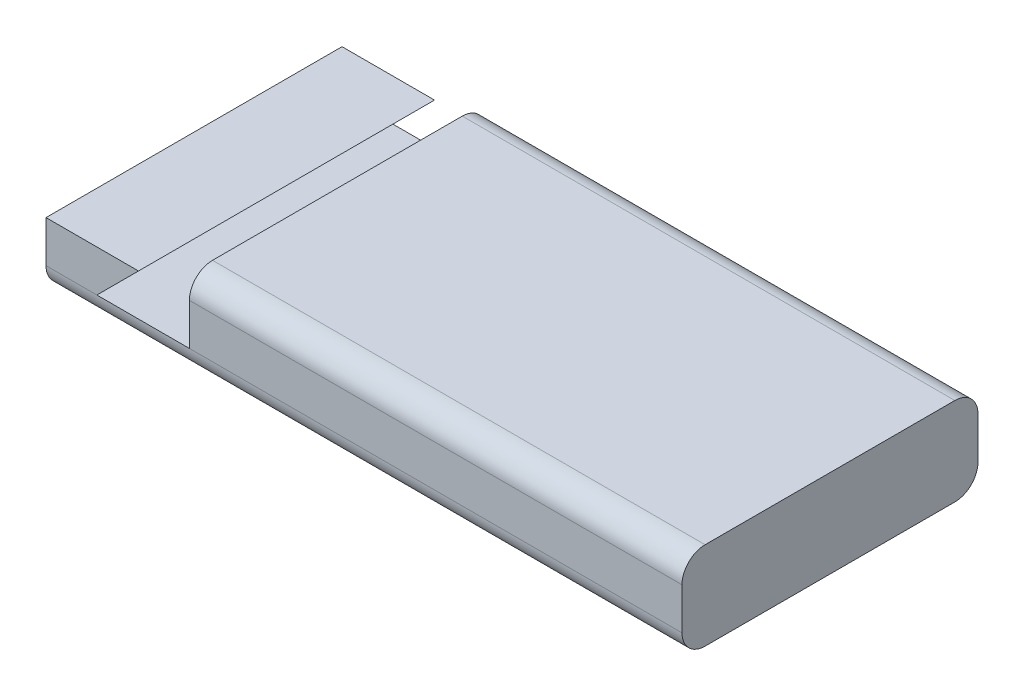
ISO-10303-21;
HEADER;
FILE_DESCRIPTION(('STEP AP214'),'2;1');
FILE_NAME('part.step','',(''),(''),'','','');
FILE_SCHEMA(('AUTOMOTIVE_DESIGN { 1 0 10303 214 1 1 1 1 }'));
ENDSEC;
DATA;
#1=APPLICATION_CONTEXT('core data for automotive mechanical design processes');
#2=APPLICATION_PROTOCOL_DEFINITION('international standard','automotive_design',2000,#1);
#3=PRODUCT_CONTEXT('',#1,'mechanical');
#4=PRODUCT('Part','Part','',(#3));
#5=PRODUCT_RELATED_PRODUCT_CATEGORY('part','',(#4));
#6=PRODUCT_DEFINITION_FORMATION('','',#4);
#7=PRODUCT_DEFINITION_CONTEXT('part definition',#1,'design');
#8=PRODUCT_DEFINITION('design','',#6,#7);
#9=PRODUCT_DEFINITION_SHAPE('','',#8);
#10=(LENGTH_UNIT() NAMED_UNIT(*) SI_UNIT(.MILLI.,.METRE.));
#11=(NAMED_UNIT(*) PLANE_ANGLE_UNIT() SI_UNIT($,.RADIAN.));
#12=(NAMED_UNIT(*) SI_UNIT($,.STERADIAN.) SOLID_ANGLE_UNIT());
#13=UNCERTAINTY_MEASURE_WITH_UNIT(LENGTH_MEASURE(1.E-05),#10,'distance_accuracy_value','');
#14=(GEOMETRIC_REPRESENTATION_CONTEXT(3) GLOBAL_UNCERTAINTY_ASSIGNED_CONTEXT((#13)) GLOBAL_UNIT_ASSIGNED_CONTEXT((#10,
#11,#12)) REPRESENTATION_CONTEXT('',''));
#15=CARTESIAN_POINT('',(0.,0.,0.));
#16=DIRECTION('',(0.,0.,1.));
#17=DIRECTION('',(1.,0.,0.));
#18=AXIS2_PLACEMENT_3D('',#15,#16,#17);
#19=CARTESIAN_POINT('',(0.,7.6,0.));
#20=DIRECTION('',(0.,0.,-1.));
#21=DIRECTION('',(-1.,0.,0.));
#22=AXIS2_PLACEMENT_3D('',#19,#20,#21);
#23=PLANE('',#22);
#24=DIRECTION('',(0.,-1.,0.));
#25=VECTOR('',#24,1.);
#26=CARTESIAN_POINT('',(0.,7.6,0.));
#27=LINE('',#26,#25);
#28=CARTESIAN_POINT('',(0.,5.6,0.));
#29=VERTEX_POINT('',#28);
#30=CARTESIAN_POINT('',(0.,2.,0.));
#31=VERTEX_POINT('',#30);
#32=EDGE_CURVE('E195',#29,#31,#27,.T.);
#33=ORIENTED_EDGE('',*,*,#32,.T.);
#34=DIRECTION('',(1.,0.,0.));
#35=VECTOR('',#34,1.);
#36=CARTESIAN_POINT('',(55.,2.,0.));
#37=LINE('',#36,#35);
#38=CARTESIAN_POINT('',(4.39999999999992,2.,0.));
#39=VERTEX_POINT('',#38);
#40=EDGE_CURVE('E156',#31,#39,#37,.T.);
#41=ORIENTED_EDGE('',*,*,#40,.T.);
#42=DIRECTION('',(-0.707106781186556,-0.707106781186539,0.));
#43=VECTOR('',#42,1.);
#44=CARTESIAN_POINT('',(1.1999999999999,-1.19999999999993,0.));
#45=LINE('',#44,#43);
#46=CARTESIAN_POINT('',(8.,5.6,0.));
#47=VERTEX_POINT('',#46);
#48=EDGE_CURVE('E149',#47,#39,#45,.T.);
#49=ORIENTED_EDGE('',*,*,#48,.F.);
#50=DIRECTION('',(1.,0.,0.));
#51=VECTOR('',#50,1.);
#52=CARTESIAN_POINT('',(0.,5.6,0.));
#53=LINE('',#52,#51);
#54=EDGE_CURVE('E174',#29,#47,#53,.T.);
#55=ORIENTED_EDGE('',*,*,#54,.F.);
#56=EDGE_LOOP('',(#33,#41,#49,#55));
#57=FACE_BOUND('',#56,.T.);
#58=ADVANCED_FACE('F33',(#57),#23,.F.);
#59=CARTESIAN_POINT('',(0.,7.6,-25.6));
#60=DIRECTION('',(0.,0.,1.));
#61=DIRECTION('',(1.,0.,0.));
#62=AXIS2_PLACEMENT_3D('',#59,#60,#61);
#63=PLANE('',#62);
#64=DIRECTION('',(0.,-1.,0.));
#65=VECTOR('',#64,1.);
#66=CARTESIAN_POINT('',(55.,7.6,-25.6));
#67=LINE('',#66,#65);
#68=CARTESIAN_POINT('',(55.,5.6,-25.6));
#69=VERTEX_POINT('',#68);
#70=CARTESIAN_POINT('',(55.,2.,-25.6));
#71=VERTEX_POINT('',#70);
#72=EDGE_CURVE('E190',#69,#71,#67,.T.);
#73=ORIENTED_EDGE('',*,*,#72,.T.);
#74=DIRECTION('',(-1.,0.,0.));
#75=VECTOR('',#74,1.);
#76=CARTESIAN_POINT('',(0.,2.,-25.6));
#77=LINE('',#76,#75);
#78=CARTESIAN_POINT('',(12.4,2.,-25.6));
#79=VERTEX_POINT('',#78);
#80=EDGE_CURVE('E202',#71,#79,#77,.T.);
#81=ORIENTED_EDGE('',*,*,#80,.T.);
#82=DIRECTION('',(0.,-1.,0.));
#83=VECTOR('',#82,1.);
#84=CARTESIAN_POINT('',(12.4,0.,-25.6));
#85=LINE('',#84,#83);
#86=CARTESIAN_POINT('',(12.4,5.6,-25.6));
#87=VERTEX_POINT('',#86);
#88=EDGE_CURVE('E138',#87,#79,#85,.T.);
#89=ORIENTED_EDGE('',*,*,#88,.F.);
#90=DIRECTION('',(-1.,0.,0.));
#91=VECTOR('',#90,1.);
#92=CARTESIAN_POINT('',(0.,5.6,-25.6));
#93=LINE('',#92,#91);
#94=EDGE_CURVE('E198',#87,#69,#93,.F.);
#95=ORIENTED_EDGE('',*,*,#94,.T.);
#96=EDGE_LOOP('',(#73,#81,#89,#95));
#97=FACE_BOUND('',#96,.T.);
#98=ADVANCED_FACE('F226',(#97),#63,.F.);
#99=CARTESIAN_POINT('',(0.,7.6,0.));
#100=DIRECTION('',(1.,0.,0.));
#101=DIRECTION('',(0.,0.,-1.));
#102=AXIS2_PLACEMENT_3D('',#99,#100,#101);
#103=PLANE('',#102);
#104=DIRECTION('',(0.,-1.,0.));
#105=VECTOR('',#104,1.);
#106=CARTESIAN_POINT('',(0.,7.6,-25.6));
#107=LINE('',#106,#105);
#108=CARTESIAN_POINT('',(0.,5.6,-25.6));
#109=VERTEX_POINT('',#108);
#110=CARTESIAN_POINT('',(0.,2.,-25.6));
#111=VERTEX_POINT('',#110);
#112=EDGE_CURVE('E180',#109,#111,#107,.T.);
#113=ORIENTED_EDGE('',*,*,#112,.T.);
#114=CARTESIAN_POINT('',(0.,2.,-23.6));
#115=DIRECTION('',(1.,0.,0.));
#116=DIRECTION('',(0.,0.,-1.));
#117=AXIS2_PLACEMENT_3D('',#114,#115,#116);
#118=CIRCLE('',#117,2.);
#119=CARTESIAN_POINT('',(0.,0.,-23.6));
#120=VERTEX_POINT('',#119);
#121=EDGE_CURVE('E207',#111,#120,#118,.F.);
#122=ORIENTED_EDGE('',*,*,#121,.T.);
#123=DIRECTION('',(0.,0.,1.));
#124=VECTOR('',#123,1.);
#125=CARTESIAN_POINT('',(0.,0.,0.));
#126=LINE('',#125,#124);
#127=CARTESIAN_POINT('',(0.,0.,-2.));
#128=VERTEX_POINT('',#127);
#129=EDGE_CURVE('E182',#120,#128,#126,.T.);
#130=ORIENTED_EDGE('',*,*,#129,.T.);
#131=CARTESIAN_POINT('',(0.,2.,-2.));
#132=DIRECTION('',(1.,0.,0.));
#133=DIRECTION('',(0.,0.,-1.));
#134=AXIS2_PLACEMENT_3D('',#131,#132,#133);
#135=CIRCLE('',#134,2.);
#136=EDGE_CURVE('E205',#128,#31,#135,.F.);
#137=ORIENTED_EDGE('',*,*,#136,.T.);
#138=ORIENTED_EDGE('',*,*,#32,.F.);
#139=DIRECTION('',(0.,0.,-1.));
#140=VECTOR('',#139,1.);
#141=CARTESIAN_POINT('',(0.,5.6,0.));
#142=LINE('',#141,#140);
#143=EDGE_CURVE('E185',#29,#109,#142,.T.);
#144=ORIENTED_EDGE('',*,*,#143,.T.);
#145=EDGE_LOOP('',(#113,#122,#130,#137,#138,#144));
#146=FACE_BOUND('',#145,.T.);
#147=ADVANCED_FACE('F253',(#146),#103,.F.);
#148=DIRECTION('',(0.,-1.,0.));
#149=VECTOR('',#148,1.);
#150=CARTESIAN_POINT('',(12.4,0.,0.));
#151=LINE('',#150,#149);
#152=CARTESIAN_POINT('',(12.4,5.6,0.));
#153=VERTEX_POINT('',#152);
#154=CARTESIAN_POINT('',(12.4,2.,0.));
#155=VERTEX_POINT('',#154);
#156=EDGE_CURVE('E120',#153,#155,#151,.T.);
#157=ORIENTED_EDGE('',*,*,#156,.T.);
#158=DIRECTION('',(1.,0.,0.));
#159=VECTOR('',#158,1.);
#160=CARTESIAN_POINT('',(55.,2.,0.));
#161=LINE('',#160,#159);
#162=CARTESIAN_POINT('',(55.,2.,0.));
#163=VERTEX_POINT('',#162);
#164=EDGE_CURVE('E125',#155,#163,#161,.T.);
#165=ORIENTED_EDGE('',*,*,#164,.T.);
#166=DIRECTION('',(0.,-1.,0.));
#167=VECTOR('',#166,1.);
#168=CARTESIAN_POINT('',(55.,7.6,0.));
#169=LINE('',#168,#167);
#170=CARTESIAN_POINT('',(55.,5.6,0.));
#171=VERTEX_POINT('',#170);
#172=EDGE_CURVE('E193',#171,#163,#169,.T.);
#173=ORIENTED_EDGE('',*,*,#172,.F.);
#174=DIRECTION('',(1.,0.,0.));
#175=VECTOR('',#174,1.);
#176=CARTESIAN_POINT('',(0.,5.6,0.));
#177=LINE('',#176,#175);
#178=EDGE_CURVE('E128',#171,#153,#177,.F.);
#179=ORIENTED_EDGE('',*,*,#178,.T.);
#180=EDGE_LOOP('',(#157,#165,#173,#179));
#181=FACE_BOUND('',#180,.T.);
#182=ADVANCED_FACE('F122',(#181),#23,.F.);
#183=DIRECTION('',(-0.707106781186556,-0.707106781186539,0.));
#184=VECTOR('',#183,1.);
#185=CARTESIAN_POINT('',(1.1999999999999,-1.19999999999993,-25.6));
#186=LINE('',#185,#184);
#187=CARTESIAN_POINT('',(8.,5.6,-25.6));
#188=VERTEX_POINT('',#187);
#189=CARTESIAN_POINT('',(4.39999999999992,2.,-25.6));
#190=VERTEX_POINT('',#189);
#191=EDGE_CURVE('E232',#188,#190,#186,.T.);
#192=ORIENTED_EDGE('',*,*,#191,.T.);
#193=DIRECTION('',(-1.,0.,0.));
#194=VECTOR('',#193,1.);
#195=CARTESIAN_POINT('',(0.,2.,-25.6));
#196=LINE('',#195,#194);
#197=EDGE_CURVE('E200',#190,#111,#196,.T.);
#198=ORIENTED_EDGE('',*,*,#197,.T.);
#199=ORIENTED_EDGE('',*,*,#112,.F.);
#200=DIRECTION('',(1.,0.,0.));
#201=VECTOR('',#200,1.);
#202=CARTESIAN_POINT('',(0.,5.6,-25.6));
#203=LINE('',#202,#201);
#204=EDGE_CURVE('E130',#109,#188,#203,.T.);
#205=ORIENTED_EDGE('',*,*,#204,.T.);
#206=EDGE_LOOP('',(#192,#198,#199,#205));
#207=FACE_BOUND('',#206,.T.);
#208=ADVANCED_FACE('F273',(#207),#63,.F.);
#209=CARTESIAN_POINT('',(55.,7.6,0.));
#210=DIRECTION('',(-1.,0.,0.));
#211=DIRECTION('',(0.,0.,1.));
#212=AXIS2_PLACEMENT_3D('',#209,#210,#211);
#213=PLANE('',#212);
#214=DIRECTION('',(0.,0.,-1.));
#215=VECTOR('',#214,1.);
#216=CARTESIAN_POINT('',(55.,0.,0.));
#217=LINE('',#216,#215);
#218=CARTESIAN_POINT('',(55.,0.,-2.));
#219=VERTEX_POINT('',#218);
#220=CARTESIAN_POINT('',(55.,0.,-23.6));
#221=VERTEX_POINT('',#220);
#222=EDGE_CURVE('E181',#219,#221,#217,.T.);
#223=ORIENTED_EDGE('',*,*,#222,.T.);
#224=CARTESIAN_POINT('',(55.,2.,-23.6));
#225=DIRECTION('',(-1.,0.,0.));
#226=DIRECTION('',(0.,0.,1.));
#227=AXIS2_PLACEMENT_3D('',#224,#225,#226);
#228=CIRCLE('',#227,2.);
#229=EDGE_CURVE('E160',#221,#71,#228,.F.);
#230=ORIENTED_EDGE('',*,*,#229,.T.);
#231=ORIENTED_EDGE('',*,*,#72,.F.);
#232=CARTESIAN_POINT('',(55.,5.6,-23.6));
#233=DIRECTION('',(-1.,0.,0.));
#234=DIRECTION('',(0.,0.,1.));
#235=AXIS2_PLACEMENT_3D('',#232,#233,#234);
#236=CIRCLE('',#235,2.);
#237=CARTESIAN_POINT('',(55.,7.6,-23.6));
#238=VERTEX_POINT('',#237);
#239=EDGE_CURVE('E215',#69,#238,#236,.F.);
#240=ORIENTED_EDGE('',*,*,#239,.T.);
#241=DIRECTION('',(0.,0.,-1.));
#242=VECTOR('',#241,1.);
#243=CARTESIAN_POINT('',(55.,7.6,0.));
#244=LINE('',#243,#242);
#245=CARTESIAN_POINT('',(55.,7.6,-2.));
#246=VERTEX_POINT('',#245);
#247=EDGE_CURVE('E172',#246,#238,#244,.T.);
#248=ORIENTED_EDGE('',*,*,#247,.F.);
#249=CARTESIAN_POINT('',(55.,5.6,-2.));
#250=DIRECTION('',(-1.,0.,0.));
#251=DIRECTION('',(0.,0.,1.));
#252=AXIS2_PLACEMENT_3D('',#249,#250,#251);
#253=CIRCLE('',#252,2.);
#254=EDGE_CURVE('E213',#246,#171,#253,.F.);
#255=ORIENTED_EDGE('',*,*,#254,.T.);
#256=ORIENTED_EDGE('',*,*,#172,.T.);
#257=CARTESIAN_POINT('',(55.,2.,-2.));
#258=DIRECTION('',(-1.,0.,0.));
#259=DIRECTION('',(0.,0.,1.));
#260=AXIS2_PLACEMENT_3D('',#257,#258,#259);
#261=CIRCLE('',#260,2.);
#262=EDGE_CURVE('E155',#163,#219,#261,.F.);
#263=ORIENTED_EDGE('',*,*,#262,.T.);
#264=EDGE_LOOP('',(#223,#230,#231,#240,#248,#255,#256,#263));
#265=FACE_BOUND('',#264,.T.);
#266=ADVANCED_FACE('F220',(#265),#213,.F.);
#267=CARTESIAN_POINT('',(0.,7.6,0.));
#268=DIRECTION('',(0.,-1.,0.));
#269=DIRECTION('',(0.,0.,-1.));
#270=AXIS2_PLACEMENT_3D('',#267,#268,#269);
#271=PLANE('',#270);
#272=ORIENTED_EDGE('',*,*,#247,.T.);
#273=DIRECTION('',(-1.,0.,0.));
#274=VECTOR('',#273,1.);
#275=CARTESIAN_POINT('',(0.,7.6,-23.6));
#276=LINE('',#275,#274);
#277=CARTESIAN_POINT('',(12.4,7.6,-23.6));
#278=VERTEX_POINT('',#277);
#279=EDGE_CURVE('E166',#238,#278,#276,.T.);
#280=ORIENTED_EDGE('',*,*,#279,.T.);
#281=DIRECTION('',(0.,0.,-1.));
#282=VECTOR('',#281,1.);
#283=CARTESIAN_POINT('',(12.4,7.6,0.));
#284=LINE('',#283,#282);
#285=CARTESIAN_POINT('',(12.4,7.6,-2.));
#286=VERTEX_POINT('',#285);
#287=EDGE_CURVE('E142',#286,#278,#284,.T.);
#288=ORIENTED_EDGE('',*,*,#287,.F.);
#289=DIRECTION('',(1.,0.,0.));
#290=VECTOR('',#289,1.);
#291=CARTESIAN_POINT('',(0.,7.6,-2.));
#292=LINE('',#291,#290);
#293=EDGE_CURVE('E158',#286,#246,#292,.T.);
#294=ORIENTED_EDGE('',*,*,#293,.T.);
#295=EDGE_LOOP('',(#272,#280,#288,#294));
#296=FACE_BOUND('',#295,.T.);
#297=ADVANCED_FACE('F169',(#296),#271,.F.);
#298=CARTESIAN_POINT('',(0.,0.,0.));
#299=DIRECTION('',(0.,-1.,0.));
#300=DIRECTION('',(0.,0.,-1.));
#301=AXIS2_PLACEMENT_3D('',#298,#299,#300);
#302=PLANE('',#301);
#303=ORIENTED_EDGE('',*,*,#129,.F.);
#304=DIRECTION('',(-1.,0.,0.));
#305=VECTOR('',#304,1.);
#306=CARTESIAN_POINT('',(55.,0.,-23.6));
#307=LINE('',#306,#305);
#308=EDGE_CURVE('E211',#120,#221,#307,.F.);
#309=ORIENTED_EDGE('',*,*,#308,.T.);
#310=ORIENTED_EDGE('',*,*,#222,.F.);
#311=DIRECTION('',(1.,0.,0.));
#312=VECTOR('',#311,1.);
#313=CARTESIAN_POINT('',(0.,0.,-2.));
#314=LINE('',#313,#312);
#315=EDGE_CURVE('E209',#219,#128,#314,.F.);
#316=ORIENTED_EDGE('',*,*,#315,.T.);
#317=EDGE_LOOP('',(#303,#309,#310,#316));
#318=FACE_BOUND('',#317,.T.);
#319=ADVANCED_FACE('F256',(#318),#302,.T.);
#320=CARTESIAN_POINT('',(0.,5.6,0.));
#321=DIRECTION('',(0.,1.,0.));
#322=DIRECTION('',(-1.,0.,0.));
#323=AXIS2_PLACEMENT_3D('',#320,#321,#322);
#324=PLANE('',#323);
#325=ORIENTED_EDGE('',*,*,#204,.F.);
#326=ORIENTED_EDGE('',*,*,#143,.F.);
#327=ORIENTED_EDGE('',*,*,#54,.T.);
#328=DIRECTION('',(0.,0.,-1.));
#329=VECTOR('',#328,1.);
#330=CARTESIAN_POINT('',(8.,5.6,0.));
#331=LINE('',#330,#329);
#332=EDGE_CURVE('E241',#47,#188,#331,.T.);
#333=ORIENTED_EDGE('',*,*,#332,.T.);
#334=EDGE_LOOP('',(#325,#326,#327,#333));
#335=FACE_BOUND('',#334,.T.);
#336=ADVANCED_FACE('F258',(#335),#324,.T.);
#337=CARTESIAN_POINT('',(1.1999999999999,-1.19999999999993,0.));
#338=DIRECTION('',(0.707106781186539,-0.707106781186556,0.));
#339=DIRECTION('',(0.707106781186556,0.707106781186539,0.));
#340=AXIS2_PLACEMENT_3D('',#337,#338,#339);
#341=PLANE('',#340);
#342=ORIENTED_EDGE('',*,*,#191,.F.);
#343=ORIENTED_EDGE('',*,*,#332,.F.);
#344=ORIENTED_EDGE('',*,*,#48,.T.);
#345=DIRECTION('',(0.,0.,-1.));
#346=VECTOR('',#345,1.);
#347=CARTESIAN_POINT('',(4.39999999999992,2.,0.));
#348=LINE('',#347,#346);
#349=EDGE_CURVE('E141',#39,#190,#348,.T.);
#350=ORIENTED_EDGE('',*,*,#349,.T.);
#351=EDGE_LOOP('',(#342,#343,#344,#350));
#352=FACE_BOUND('',#351,.T.);
#353=ADVANCED_FACE('F245',(#352),#341,.T.);
#354=CARTESIAN_POINT('',(0.,2.,0.));
#355=DIRECTION('',(0.,-1.,0.));
#356=DIRECTION('',(0.,0.,-1.));
#357=AXIS2_PLACEMENT_3D('',#354,#355,#356);
#358=PLANE('',#357);
#359=DIRECTION('',(-1.,0.,0.));
#360=VECTOR('',#359,1.);
#361=CARTESIAN_POINT('',(0.,2.,-25.6));
#362=LINE('',#361,#360);
#363=EDGE_CURVE('E229',#79,#190,#362,.T.);
#364=ORIENTED_EDGE('',*,*,#363,.T.);
#365=ORIENTED_EDGE('',*,*,#349,.F.);
#366=DIRECTION('',(-1.,0.,0.));
#367=VECTOR('',#366,1.);
#368=CARTESIAN_POINT('',(0.,2.,0.));
#369=LINE('',#368,#367);
#370=EDGE_CURVE('E129',#155,#39,#369,.T.);
#371=ORIENTED_EDGE('',*,*,#370,.F.);
#372=DIRECTION('',(0.,0.,-1.));
#373=VECTOR('',#372,1.);
#374=CARTESIAN_POINT('',(12.4,2.,0.));
#375=LINE('',#374,#373);
#376=EDGE_CURVE('E134',#155,#79,#375,.T.);
#377=ORIENTED_EDGE('',*,*,#376,.T.);
#378=EDGE_LOOP('',(#364,#365,#371,#377));
#379=FACE_BOUND('',#378,.T.);
#380=ADVANCED_FACE('F145',(#379),#358,.F.);
#381=CARTESIAN_POINT('',(12.4,0.,0.));
#382=DIRECTION('',(1.,0.,0.));
#383=DIRECTION('',(0.,1.,0.));
#384=AXIS2_PLACEMENT_3D('',#381,#382,#383);
#385=PLANE('',#384);
#386=ORIENTED_EDGE('',*,*,#287,.T.);
#387=CARTESIAN_POINT('',(12.4,5.6,-23.6));
#388=DIRECTION('',(1.,0.,0.));
#389=DIRECTION('',(0.,1.,0.));
#390=AXIS2_PLACEMENT_3D('',#387,#388,#389);
#391=CIRCLE('',#390,2.);
#392=EDGE_CURVE('E11',#278,#87,#391,.F.);
#393=ORIENTED_EDGE('',*,*,#392,.T.);
#394=ORIENTED_EDGE('',*,*,#88,.T.);
#395=ORIENTED_EDGE('',*,*,#376,.F.);
#396=ORIENTED_EDGE('',*,*,#156,.F.);
#397=CARTESIAN_POINT('',(12.4,5.6,-2.));
#398=DIRECTION('',(1.,0.,0.));
#399=DIRECTION('',(0.,1.,0.));
#400=AXIS2_PLACEMENT_3D('',#397,#398,#399);
#401=CIRCLE('',#400,2.);
#402=EDGE_CURVE('E41',#153,#286,#401,.F.);
#403=ORIENTED_EDGE('',*,*,#402,.T.);
#404=EDGE_LOOP('',(#386,#393,#394,#395,#396,#403));
#405=FACE_BOUND('',#404,.T.);
#406=ADVANCED_FACE('F136',(#405),#385,.F.);
#407=CARTESIAN_POINT('',(0.,2.,-23.6));
#408=DIRECTION('',(1.,0.,0.));
#409=DIRECTION('',(0.,0.,-1.));
#410=AXIS2_PLACEMENT_3D('',#407,#408,#409);
#411=CYLINDRICAL_SURFACE('',#410,2.);
#412=ORIENTED_EDGE('',*,*,#229,.F.);
#413=ORIENTED_EDGE('',*,*,#308,.F.);
#414=ORIENTED_EDGE('',*,*,#121,.F.);
#415=ORIENTED_EDGE('',*,*,#197,.F.);
#416=ORIENTED_EDGE('',*,*,#363,.F.);
#417=ORIENTED_EDGE('',*,*,#80,.F.);
#418=EDGE_LOOP('',(#412,#413,#414,#415,#416,#417));
#419=FACE_BOUND('',#418,.T.);
#420=ADVANCED_FACE('F227',(#419),#411,.T.);
#421=CARTESIAN_POINT('',(0.,2.,-2.));
#422=DIRECTION('',(-1.,0.,0.));
#423=DIRECTION('',(0.,0.,1.));
#424=AXIS2_PLACEMENT_3D('',#421,#422,#423);
#425=CYLINDRICAL_SURFACE('',#424,2.);
#426=ORIENTED_EDGE('',*,*,#136,.F.);
#427=ORIENTED_EDGE('',*,*,#315,.F.);
#428=ORIENTED_EDGE('',*,*,#262,.F.);
#429=ORIENTED_EDGE('',*,*,#164,.F.);
#430=ORIENTED_EDGE('',*,*,#370,.T.);
#431=ORIENTED_EDGE('',*,*,#40,.F.);
#432=EDGE_LOOP('',(#426,#427,#428,#429,#430,#431));
#433=FACE_BOUND('',#432,.T.);
#434=ADVANCED_FACE('F153',(#433),#425,.T.);
#435=CARTESIAN_POINT('',(0.,5.6,-23.6));
#436=DIRECTION('',(-1.,0.,0.));
#437=DIRECTION('',(0.,0.,1.));
#438=AXIS2_PLACEMENT_3D('',#435,#436,#437);
#439=CYLINDRICAL_SURFACE('',#438,2.);
#440=ORIENTED_EDGE('',*,*,#239,.F.);
#441=ORIENTED_EDGE('',*,*,#94,.F.);
#442=ORIENTED_EDGE('',*,*,#392,.F.);
#443=ORIENTED_EDGE('',*,*,#279,.F.);
#444=EDGE_LOOP('',(#440,#441,#442,#443));
#445=FACE_BOUND('',#444,.T.);
#446=ADVANCED_FACE('F288',(#445),#439,.T.);
#447=CARTESIAN_POINT('',(0.,5.6,-2.));
#448=DIRECTION('',(1.,0.,0.));
#449=DIRECTION('',(0.,0.,-1.));
#450=AXIS2_PLACEMENT_3D('',#447,#448,#449);
#451=CYLINDRICAL_SURFACE('',#450,2.);
#452=ORIENTED_EDGE('',*,*,#402,.F.);
#453=ORIENTED_EDGE('',*,*,#178,.F.);
#454=ORIENTED_EDGE('',*,*,#254,.F.);
#455=ORIENTED_EDGE('',*,*,#293,.F.);
#456=EDGE_LOOP('',(#452,#453,#454,#455));
#457=FACE_BOUND('',#456,.T.);
#458=ADVANCED_FACE('F35',(#457),#451,.T.);
#459=CLOSED_SHELL('',(#58,#98,#147,#182,#208,#266,#297,#319,#336,#353,#380,#406,#420,#434,#446,#458));
#460=MANIFOLD_SOLID_BREP('B2',#459);
#461=ADVANCED_BREP_SHAPE_REPRESENTATION('',(#18,#460),#14);
#462=SHAPE_DEFINITION_REPRESENTATION(#9,#461);
ENDSEC;
END-ISO-10303-21;
